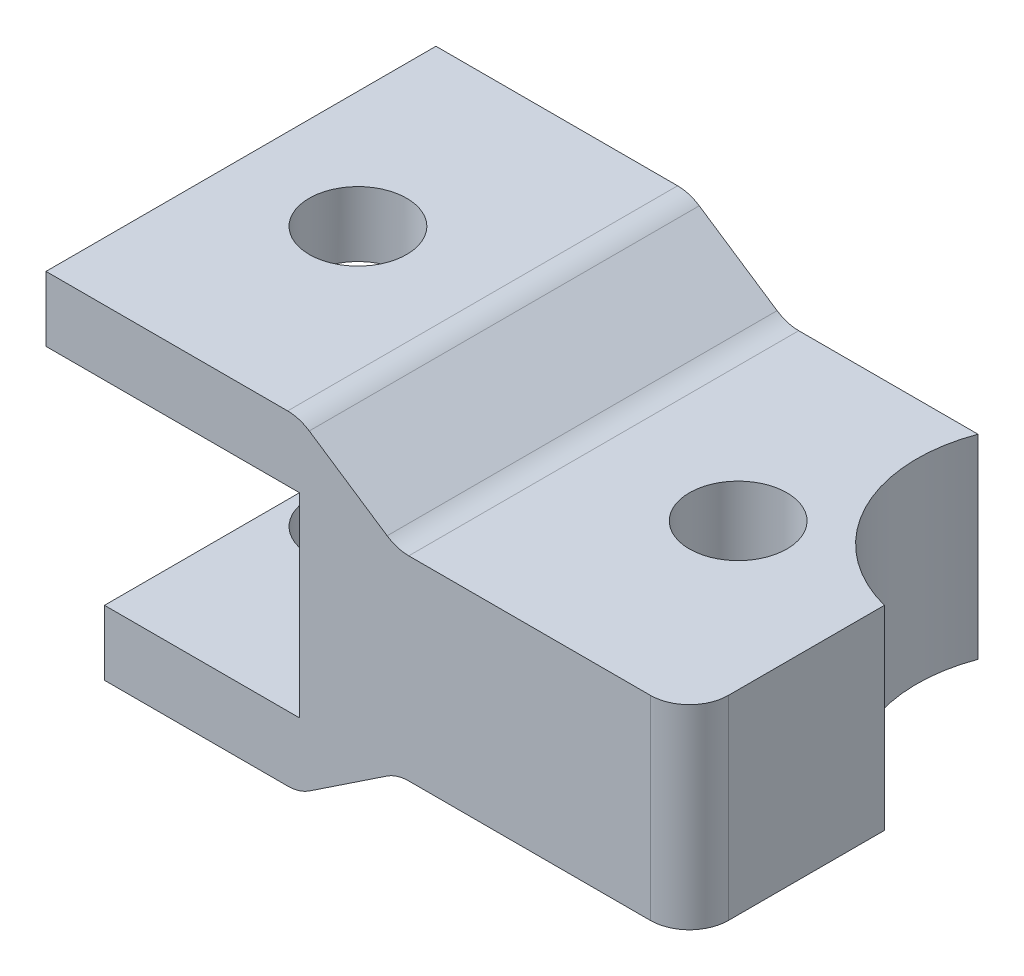
ISO-10303-21;
HEADER;
FILE_DESCRIPTION(('STEP AP214'),'2;1');
FILE_NAME('part.step','',(''),(''),'','','');
FILE_SCHEMA(('AUTOMOTIVE_DESIGN { 1 0 10303 214 1 1 1 1 }'));
ENDSEC;
DATA;
#1=APPLICATION_CONTEXT('core data for automotive mechanical design processes');
#2=APPLICATION_PROTOCOL_DEFINITION('international standard','automotive_design',2000,#1);
#3=PRODUCT_CONTEXT('',#1,'mechanical');
#4=PRODUCT('Part','Part','',(#3));
#5=PRODUCT_RELATED_PRODUCT_CATEGORY('part','',(#4));
#6=PRODUCT_DEFINITION_FORMATION('','',#4);
#7=PRODUCT_DEFINITION_CONTEXT('part definition',#1,'design');
#8=PRODUCT_DEFINITION('design','',#6,#7);
#9=PRODUCT_DEFINITION_SHAPE('','',#8);
#10=(LENGTH_UNIT() NAMED_UNIT(*) SI_UNIT(.MILLI.,.METRE.));
#11=(NAMED_UNIT(*) PLANE_ANGLE_UNIT() SI_UNIT($,.RADIAN.));
#12=(NAMED_UNIT(*) SI_UNIT($,.STERADIAN.) SOLID_ANGLE_UNIT());
#13=UNCERTAINTY_MEASURE_WITH_UNIT(LENGTH_MEASURE(1.E-05),#10,'distance_accuracy_value','');
#14=(GEOMETRIC_REPRESENTATION_CONTEXT(3) GLOBAL_UNCERTAINTY_ASSIGNED_CONTEXT((#13)) GLOBAL_UNIT_ASSIGNED_CONTEXT((#10,
#11,#12)) REPRESENTATION_CONTEXT('',''));
#15=CARTESIAN_POINT('',(0.,0.,0.));
#16=DIRECTION('',(0.,0.,1.));
#17=DIRECTION('',(1.,0.,0.));
#18=AXIS2_PLACEMENT_3D('',#15,#16,#17);
#19=CARTESIAN_POINT('',(5.85829192129549,-8.79095426364869,25.4));
#20=DIRECTION('',(-0.554546558579448,0.832152698948751,0.));
#21=DIRECTION('',(-0.832152698948751,-0.554546558579448,0.));
#22=AXIS2_PLACEMENT_3D('',#19,#20,#21);
#23=PLANE('',#22);
#24=DIRECTION('',(0.832152698948751,0.554546558579448,0.));
#25=VECTOR('',#24,1.);
#26=CARTESIAN_POINT('',(5.85829192129549,-8.79095426364869,0.));
#27=LINE('',#26,#25);
#28=CARTESIAN_POINT('',(13.3397541186527,-3.80530785532983,0.));
#29=VERTEX_POINT('',#28);
#30=CARTESIAN_POINT('',(18.4102458813473,-0.426332144670171,0.));
#31=VERTEX_POINT('',#30);
#32=EDGE_CURVE('E279',#29,#31,#27,.T.);
#33=ORIENTED_EDGE('',*,*,#32,.T.);
#34=DIRECTION('',(0.,0.,-1.));
#35=VECTOR('',#34,1.);
#36=CARTESIAN_POINT('',(18.4102458813473,-0.426332144670173,25.4));
#37=LINE('',#36,#35);
#38=CARTESIAN_POINT('',(18.4102458813473,-0.426332144670171,25.4));
#39=VERTEX_POINT('',#38);
#40=EDGE_CURVE('E356',#31,#39,#37,.F.);
#41=ORIENTED_EDGE('',*,*,#40,.T.);
#42=DIRECTION('',(0.832152698948751,0.554546558579448,0.));
#43=VECTOR('',#42,1.);
#44=CARTESIAN_POINT('',(5.85829192129549,-8.79095426364869,25.4));
#45=LINE('',#44,#43);
#46=CARTESIAN_POINT('',(13.3397541186527,-3.80530785532983,25.4));
#47=VERTEX_POINT('',#46);
#48=EDGE_CURVE('E255',#47,#39,#45,.T.);
#49=ORIENTED_EDGE('',*,*,#48,.F.);
#50=DIRECTION('',(0.,0.,-1.));
#51=VECTOR('',#50,1.);
#52=CARTESIAN_POINT('',(13.3397541186527,-3.80530785532983,25.4));
#53=LINE('',#52,#51);
#54=EDGE_CURVE('E353',#47,#29,#53,.T.);
#55=ORIENTED_EDGE('',*,*,#54,.T.);
#56=EDGE_LOOP('',(#33,#41,#49,#55));
#57=FACE_BOUND('',#56,.T.);
#58=ADVANCED_FACE('F86',(#57),#23,.F.);
#59=CARTESIAN_POINT('',(0.,0.,25.4));
#60=DIRECTION('',(0.,1.,0.));
#61=DIRECTION('',(0.,0.,1.));
#62=AXIS2_PLACEMENT_3D('',#59,#60,#61);
#63=PLANE('',#62);
#64=CARTESIAN_POINT('',(28.575,0.,12.7));
#65=DIRECTION('',(0.,1.,0.));
#66=DIRECTION('',(0.,0.,1.));
#67=AXIS2_PLACEMENT_3D('',#64,#65,#66);
#68=CIRCLE('',#67,3.175);
#69=CARTESIAN_POINT('',(28.575,0.,15.875));
#70=VERTEX_POINT('',#69);
#71=EDGE_CURVE('E235',#70,#70,#68,.T.);
#72=ORIENTED_EDGE('',*,*,#71,.T.);
#73=EDGE_LOOP('',(#72));
#74=FACE_BOUND('',#73,.T.);
#75=DIRECTION('',(0.,0.,-1.));
#76=VECTOR('',#75,1.);
#77=CARTESIAN_POINT('',(38.1,0.,25.4));
#78=LINE('',#77,#76);
#79=CARTESIAN_POINT('',(38.1,0.,22.86));
#80=VERTEX_POINT('',#79);
#81=CARTESIAN_POINT('',(38.1,0.,12.7));
#82=VERTEX_POINT('',#81);
#83=EDGE_CURVE('E208',#80,#82,#78,.T.);
#84=ORIENTED_EDGE('',*,*,#83,.F.);
#85=CARTESIAN_POINT('',(35.56,0.,22.86));
#86=DIRECTION('',(0.,1.,0.));
#87=DIRECTION('',(0.,0.,1.));
#88=AXIS2_PLACEMENT_3D('',#85,#86,#87);
#89=CIRCLE('',#88,2.54);
#90=CARTESIAN_POINT('',(35.56,0.,25.4));
#91=VERTEX_POINT('',#90);
#92=EDGE_CURVE('E351',#80,#91,#89,.F.);
#93=ORIENTED_EDGE('',*,*,#92,.T.);
#94=DIRECTION('',(1.,0.,0.));
#95=VECTOR('',#94,1.);
#96=CARTESIAN_POINT('',(0.,0.,25.4));
#97=LINE('',#96,#95);
#98=CARTESIAN_POINT('',(19.8187941401391,0.,25.4));
#99=VERTEX_POINT('',#98);
#100=EDGE_CURVE('E259',#99,#91,#97,.T.);
#101=ORIENTED_EDGE('',*,*,#100,.F.);
#102=DIRECTION('',(0.,0.,-1.));
#103=VECTOR('',#102,1.);
#104=CARTESIAN_POINT('',(19.8187941401391,0.,0.));
#105=LINE('',#104,#103);
#106=CARTESIAN_POINT('',(19.8187941401391,0.,0.));
#107=VERTEX_POINT('',#106);
#108=EDGE_CURVE('E349',#99,#107,#105,.T.);
#109=ORIENTED_EDGE('',*,*,#108,.T.);
#110=DIRECTION('',(1.,0.,0.));
#111=VECTOR('',#110,1.);
#112=CARTESIAN_POINT('',(0.,0.,0.));
#113=LINE('',#112,#111);
#114=CARTESIAN_POINT('',(31.497009702088,0.,0.));
#115=VERTEX_POINT('',#114);
#116=EDGE_CURVE('E231',#107,#115,#113,.T.);
#117=ORIENTED_EDGE('',*,*,#116,.T.);
#118=CARTESIAN_POINT('',(40.5242890458702,0.,3.37304744201766));
#119=DIRECTION('',(0.,1.,0.));
#120=DIRECTION('',(0.,0.,1.));
#121=AXIS2_PLACEMENT_3D('',#118,#119,#120);
#122=CIRCLE('',#121,9.63686782086273);
#123=EDGE_CURVE('E223',#115,#82,#122,.T.);
#124=ORIENTED_EDGE('',*,*,#123,.T.);
#125=EDGE_LOOP('',(#84,#93,#101,#109,#117,#124));
#126=FACE_BOUND('',#125,.T.);
#127=ADVANCED_FACE('F228',(#74,#126),#63,.F.);
#128=CARTESIAN_POINT('',(38.1,0.,25.4));
#129=DIRECTION('',(-1.,0.,0.));
#130=DIRECTION('',(0.,0.,1.));
#131=AXIS2_PLACEMENT_3D('',#128,#129,#130);
#132=PLANE('',#131);
#133=DIRECTION('',(0.,0.,-1.));
#134=VECTOR('',#133,1.);
#135=CARTESIAN_POINT('',(38.1,12.7,25.4));
#136=LINE('',#135,#134);
#137=CARTESIAN_POINT('',(38.1,12.7,22.86));
#138=VERTEX_POINT('',#137);
#139=CARTESIAN_POINT('',(38.1,12.7,12.7));
#140=VERTEX_POINT('',#139);
#141=EDGE_CURVE('E216',#138,#140,#136,.T.);
#142=ORIENTED_EDGE('',*,*,#141,.F.);
#143=DIRECTION('',(0.,1.,0.));
#144=VECTOR('',#143,1.);
#145=CARTESIAN_POINT('',(38.1,0.,22.86));
#146=LINE('',#145,#144);
#147=EDGE_CURVE('E101',#138,#80,#146,.F.);
#148=ORIENTED_EDGE('',*,*,#147,.T.);
#149=ORIENTED_EDGE('',*,*,#83,.T.);
#150=DIRECTION('',(0.,1.,0.));
#151=VECTOR('',#150,1.);
#152=CARTESIAN_POINT('',(38.1,-4.23164,12.7));
#153=LINE('',#152,#151);
#154=EDGE_CURVE('E211',#82,#140,#153,.T.);
#155=ORIENTED_EDGE('',*,*,#154,.T.);
#156=EDGE_LOOP('',(#142,#148,#149,#155));
#157=FACE_BOUND('',#156,.T.);
#158=ADVANCED_FACE('F210',(#157),#132,.F.);
#159=CARTESIAN_POINT('',(0.,12.7,25.4));
#160=DIRECTION('',(0.,1.,0.));
#161=DIRECTION('',(0.,0.,1.));
#162=AXIS2_PLACEMENT_3D('',#159,#160,#161);
#163=PLANE('',#162);
#164=DIRECTION('',(1.,0.,0.));
#165=VECTOR('',#164,1.);
#166=CARTESIAN_POINT('',(0.,12.7,0.));
#167=LINE('',#166,#165);
#168=CARTESIAN_POINT('',(19.8187941401391,12.7,0.));
#169=VERTEX_POINT('',#168);
#170=CARTESIAN_POINT('',(31.497009702088,12.7,0.));
#171=VERTEX_POINT('',#170);
#172=EDGE_CURVE('E284',#169,#171,#167,.T.);
#173=ORIENTED_EDGE('',*,*,#172,.F.);
#174=DIRECTION('',(0.,0.,-1.));
#175=VECTOR('',#174,1.);
#176=CARTESIAN_POINT('',(19.8187941401391,12.7,25.4));
#177=LINE('',#176,#175);
#178=CARTESIAN_POINT('',(19.8187941401391,12.7,25.4));
#179=VERTEX_POINT('',#178);
#180=EDGE_CURVE('E346',#169,#179,#177,.F.);
#181=ORIENTED_EDGE('',*,*,#180,.T.);
#182=DIRECTION('',(1.,0.,0.));
#183=VECTOR('',#182,1.);
#184=CARTESIAN_POINT('',(0.,12.7,25.4));
#185=LINE('',#184,#183);
#186=CARTESIAN_POINT('',(35.56,12.7,25.4));
#187=VERTEX_POINT('',#186);
#188=EDGE_CURVE('E262',#179,#187,#185,.T.);
#189=ORIENTED_EDGE('',*,*,#188,.T.);
#190=CARTESIAN_POINT('',(35.56,12.7,22.86));
#191=DIRECTION('',(0.,1.,0.));
#192=DIRECTION('',(0.,0.,1.));
#193=AXIS2_PLACEMENT_3D('',#190,#191,#192);
#194=CIRCLE('',#193,2.54);
#195=EDGE_CURVE('E109',#187,#138,#194,.T.);
#196=ORIENTED_EDGE('',*,*,#195,.T.);
#197=ORIENTED_EDGE('',*,*,#141,.T.);
#198=CARTESIAN_POINT('',(40.5242890458702,12.7,3.37304744201766));
#199=DIRECTION('',(0.,1.,0.));
#200=DIRECTION('',(0.,0.,1.));
#201=AXIS2_PLACEMENT_3D('',#198,#199,#200);
#202=CIRCLE('',#201,9.63686782086273);
#203=EDGE_CURVE('E226',#171,#140,#202,.T.);
#204=ORIENTED_EDGE('',*,*,#203,.F.);
#205=EDGE_LOOP('',(#173,#181,#189,#196,#197,#204));
#206=FACE_BOUND('',#205,.T.);
#207=CARTESIAN_POINT('',(28.575,12.7,12.7));
#208=DIRECTION('',(0.,1.,0.));
#209=DIRECTION('',(0.,0.,1.));
#210=AXIS2_PLACEMENT_3D('',#207,#208,#209);
#211=CIRCLE('',#210,3.175);
#212=CARTESIAN_POINT('',(28.575,12.7,15.875));
#213=VERTEX_POINT('',#212);
#214=EDGE_CURVE('E232',#213,#213,#211,.T.);
#215=ORIENTED_EDGE('',*,*,#214,.F.);
#216=EDGE_LOOP('',(#215));
#217=FACE_BOUND('',#216,.T.);
#218=ADVANCED_FACE('F385',(#206,#217),#163,.T.);
#219=CARTESIAN_POINT('',(11.7189280970613,17.5854263161184,25.4));
#220=DIRECTION('',(0.554546558579448,0.832152698948751,0.));
#221=DIRECTION('',(-0.832152698948751,0.554546558579448,0.));
#222=AXIS2_PLACEMENT_3D('',#219,#220,#221);
#223=PLANE('',#222);
#224=DIRECTION('',(0.832152698948751,-0.554546558579448,0.));
#225=VECTOR('',#224,1.);
#226=CARTESIAN_POINT('',(11.7189280970613,17.5854263161184,0.));
#227=LINE('',#226,#225);
#228=CARTESIAN_POINT('',(13.3397541186527,16.5053078553298,0.));
#229=VERTEX_POINT('',#228);
#230=CARTESIAN_POINT('',(18.4102458813473,13.1263321446702,0.));
#231=VERTEX_POINT('',#230);
#232=EDGE_CURVE('E286',#229,#231,#227,.T.);
#233=ORIENTED_EDGE('',*,*,#232,.F.);
#234=DIRECTION('',(0.,0.,-1.));
#235=VECTOR('',#234,1.);
#236=CARTESIAN_POINT('',(13.3397541186527,16.5053078553298,25.4));
#237=LINE('',#236,#235);
#238=CARTESIAN_POINT('',(13.3397541186527,16.5053078553298,25.4));
#239=VERTEX_POINT('',#238);
#240=EDGE_CURVE('E336',#229,#239,#237,.F.);
#241=ORIENTED_EDGE('',*,*,#240,.T.);
#242=DIRECTION('',(0.832152698948751,-0.554546558579448,0.));
#243=VECTOR('',#242,1.);
#244=CARTESIAN_POINT('',(11.7189280970613,17.5854263161184,25.4));
#245=LINE('',#244,#243);
#246=CARTESIAN_POINT('',(18.4102458813473,13.1263321446702,25.4));
#247=VERTEX_POINT('',#246);
#248=EDGE_CURVE('E264',#239,#247,#245,.T.);
#249=ORIENTED_EDGE('',*,*,#248,.T.);
#250=DIRECTION('',(0.,0.,-1.));
#251=VECTOR('',#250,1.);
#252=CARTESIAN_POINT('',(18.4102458813473,13.1263321446702,0.));
#253=LINE('',#252,#251);
#254=EDGE_CURVE('E333',#247,#231,#253,.T.);
#255=ORIENTED_EDGE('',*,*,#254,.T.);
#256=EDGE_LOOP('',(#233,#241,#249,#255));
#257=FACE_BOUND('',#256,.T.);
#258=ADVANCED_FACE('F394',(#257),#223,.T.);
#259=CARTESIAN_POINT('',(12.7,0.,25.4));
#260=DIRECTION('',(-1.,0.,0.));
#261=DIRECTION('',(0.,0.,1.));
#262=AXIS2_PLACEMENT_3D('',#259,#260,#261);
#263=PLANE('',#262);
#264=DIRECTION('',(0.,0.,1.));
#265=VECTOR('',#264,1.);
#266=CARTESIAN_POINT('',(12.7,12.7,25.4));
#267=LINE('',#266,#265);
#268=CARTESIAN_POINT('',(12.7,12.7,0.));
#269=VERTEX_POINT('',#268);
#270=CARTESIAN_POINT('',(12.7,12.7,25.4));
#271=VERTEX_POINT('',#270);
#272=EDGE_CURVE('E215',#269,#271,#267,.T.);
#273=ORIENTED_EDGE('',*,*,#272,.F.);
#274=DIRECTION('',(0.,1.,0.));
#275=VECTOR('',#274,1.);
#276=CARTESIAN_POINT('',(12.7,0.,0.));
#277=LINE('',#276,#275);
#278=CARTESIAN_POINT('',(12.7,0.,0.));
#279=VERTEX_POINT('',#278);
#280=EDGE_CURVE('E289',#279,#269,#277,.T.);
#281=ORIENTED_EDGE('',*,*,#280,.F.);
#282=DIRECTION('',(0.,0.,-1.));
#283=VECTOR('',#282,1.);
#284=CARTESIAN_POINT('',(12.7,0.,25.4));
#285=LINE('',#284,#283);
#286=CARTESIAN_POINT('',(12.7,0.,25.4));
#287=VERTEX_POINT('',#286);
#288=EDGE_CURVE('E300',#287,#279,#285,.T.);
#289=ORIENTED_EDGE('',*,*,#288,.F.);
#290=DIRECTION('',(0.,1.,0.));
#291=VECTOR('',#290,1.);
#292=CARTESIAN_POINT('',(12.7,0.,25.4));
#293=LINE('',#292,#291);
#294=EDGE_CURVE('E267',#287,#271,#293,.T.);
#295=ORIENTED_EDGE('',*,*,#294,.T.);
#296=EDGE_LOOP('',(#273,#281,#289,#295));
#297=FACE_BOUND('',#296,.T.);
#298=ADVANCED_FACE('F413',(#297),#263,.T.);
#299=CARTESIAN_POINT('',(0.,0.,25.4));
#300=DIRECTION('',(0.,1.,0.));
#301=DIRECTION('',(0.,0.,1.));
#302=AXIS2_PLACEMENT_3D('',#299,#300,#301);
#303=PLANE('',#302);
#304=CARTESIAN_POINT('',(3.8099999999996,0.,12.7000000000001));
#305=DIRECTION('',(0.,1.,0.));
#306=DIRECTION('',(0.,0.,1.));
#307=AXIS2_PLACEMENT_3D('',#304,#305,#306);
#308=CIRCLE('',#307,3.175);
#309=CARTESIAN_POINT('',(3.8099999999996,0.,15.8750000000001));
#310=VERTEX_POINT('',#309);
#311=EDGE_CURVE('E248',#310,#310,#308,.T.);
#312=ORIENTED_EDGE('',*,*,#311,.F.);
#313=EDGE_LOOP('',(#312));
#314=FACE_BOUND('',#313,.T.);
#315=DIRECTION('',(1.,0.,0.));
#316=VECTOR('',#315,1.);
#317=CARTESIAN_POINT('',(0.,0.,0.));
#318=LINE('',#317,#316);
#319=CARTESIAN_POINT('',(0.,0.,0.));
#320=VERTEX_POINT('',#319);
#321=EDGE_CURVE('E292',#320,#279,#318,.T.);
#322=ORIENTED_EDGE('',*,*,#321,.F.);
#323=DIRECTION('',(0.,0.,-1.));
#324=VECTOR('',#323,1.);
#325=CARTESIAN_POINT('',(0.,0.,25.4));
#326=LINE('',#325,#324);
#327=CARTESIAN_POINT('',(0.,0.,25.4));
#328=VERTEX_POINT('',#327);
#329=EDGE_CURVE('E298',#328,#320,#326,.T.);
#330=ORIENTED_EDGE('',*,*,#329,.F.);
#331=DIRECTION('',(1.,0.,0.));
#332=VECTOR('',#331,1.);
#333=CARTESIAN_POINT('',(0.,0.,25.4));
#334=LINE('',#333,#332);
#335=EDGE_CURVE('E270',#328,#287,#334,.T.);
#336=ORIENTED_EDGE('',*,*,#335,.T.);
#337=ORIENTED_EDGE('',*,*,#288,.T.);
#338=EDGE_LOOP('',(#322,#330,#336,#337));
#339=FACE_BOUND('',#338,.T.);
#340=ADVANCED_FACE('F418',(#314,#339),#303,.T.);
#341=CARTESIAN_POINT('',(0.,0.,25.4));
#342=DIRECTION('',(1.,0.,0.));
#343=DIRECTION('',(0.,0.,-1.));
#344=AXIS2_PLACEMENT_3D('',#341,#342,#343);
#345=PLANE('',#344);
#346=DIRECTION('',(0.,-1.,0.));
#347=VECTOR('',#346,1.);
#348=CARTESIAN_POINT('',(0.,0.,0.));
#349=LINE('',#348,#347);
#350=CARTESIAN_POINT('',(0.,-4.23164,0.));
#351=VERTEX_POINT('',#350);
#352=EDGE_CURVE('E256',#320,#351,#349,.T.);
#353=ORIENTED_EDGE('',*,*,#352,.T.);
#354=DIRECTION('',(0.,0.,-1.));
#355=VECTOR('',#354,1.);
#356=CARTESIAN_POINT('',(0.,-4.23164,25.4));
#357=LINE('',#356,#355);
#358=CARTESIAN_POINT('',(0.,-4.23164,25.4));
#359=VERTEX_POINT('',#358);
#360=EDGE_CURVE('E275',#359,#351,#357,.T.);
#361=ORIENTED_EDGE('',*,*,#360,.F.);
#362=DIRECTION('',(0.,-1.,0.));
#363=VECTOR('',#362,1.);
#364=CARTESIAN_POINT('',(0.,0.,25.4));
#365=LINE('',#364,#363);
#366=EDGE_CURVE('E273',#328,#359,#365,.T.);
#367=ORIENTED_EDGE('',*,*,#366,.F.);
#368=ORIENTED_EDGE('',*,*,#329,.T.);
#369=EDGE_LOOP('',(#353,#361,#367,#368));
#370=FACE_BOUND('',#369,.T.);
#371=ADVANCED_FACE('F424',(#370),#345,.F.);
#372=CARTESIAN_POINT('',(0.,-4.23164,25.4));
#373=DIRECTION('',(0.,1.,0.));
#374=DIRECTION('',(0.,0.,1.));
#375=AXIS2_PLACEMENT_3D('',#372,#373,#374);
#376=PLANE('',#375);
#377=CARTESIAN_POINT('',(3.8099999999996,-4.23164,12.7000000000001));
#378=DIRECTION('',(0.,1.,0.));
#379=DIRECTION('',(0.,0.,1.));
#380=AXIS2_PLACEMENT_3D('',#377,#378,#379);
#381=CIRCLE('',#380,3.175);
#382=CARTESIAN_POINT('',(3.8099999999996,-4.23164,15.8750000000001));
#383=VERTEX_POINT('',#382);
#384=EDGE_CURVE('E244',#383,#383,#381,.T.);
#385=ORIENTED_EDGE('',*,*,#384,.T.);
#386=EDGE_LOOP('',(#385));
#387=FACE_BOUND('',#386,.T.);
#388=DIRECTION('',(1.,0.,0.));
#389=VECTOR('',#388,1.);
#390=CARTESIAN_POINT('',(0.,-4.23164,0.));
#391=LINE('',#390,#389);
#392=CARTESIAN_POINT('',(11.9312058598609,-4.23164,0.));
#393=VERTEX_POINT('',#392);
#394=EDGE_CURVE('E276',#351,#393,#391,.T.);
#395=ORIENTED_EDGE('',*,*,#394,.T.);
#396=DIRECTION('',(0.,0.,-1.));
#397=VECTOR('',#396,1.);
#398=CARTESIAN_POINT('',(11.9312058598609,-4.23164,25.4));
#399=LINE('',#398,#397);
#400=CARTESIAN_POINT('',(11.9312058598609,-4.23164,25.4));
#401=VERTEX_POINT('',#400);
#402=EDGE_CURVE('E358',#393,#401,#399,.F.);
#403=ORIENTED_EDGE('',*,*,#402,.T.);
#404=DIRECTION('',(1.,0.,0.));
#405=VECTOR('',#404,1.);
#406=CARTESIAN_POINT('',(0.,-4.23164,25.4));
#407=LINE('',#406,#405);
#408=EDGE_CURVE('E252',#359,#401,#407,.T.);
#409=ORIENTED_EDGE('',*,*,#408,.F.);
#410=ORIENTED_EDGE('',*,*,#360,.T.);
#411=EDGE_LOOP('',(#395,#403,#409,#410));
#412=FACE_BOUND('',#411,.T.);
#413=ADVANCED_FACE('F428',(#387,#412),#376,.F.);
#414=CARTESIAN_POINT('',(0.,0.,0.));
#415=DIRECTION('',(0.,0.,1.));
#416=DIRECTION('',(1.,0.,0.));
#417=AXIS2_PLACEMENT_3D('',#414,#415,#416);
#418=PLANE('',#417);
#419=DIRECTION('',(-1.,0.,0.));
#420=VECTOR('',#419,1.);
#421=CARTESIAN_POINT('',(12.7,16.93164,0.));
#422=LINE('',#421,#420);
#423=CARTESIAN_POINT('',(11.9312058598609,16.93164,0.));
#424=VERTEX_POINT('',#423);
#425=CARTESIAN_POINT('',(-3.81000000000001,16.93164,0.));
#426=VERTEX_POINT('',#425);
#427=EDGE_CURVE('E309',#424,#426,#422,.T.);
#428=ORIENTED_EDGE('',*,*,#427,.F.);
#429=CARTESIAN_POINT('',(11.9312058598609,14.39164,0.));
#430=DIRECTION('',(0.,0.,1.));
#431=DIRECTION('',(1.,0.,0.));
#432=AXIS2_PLACEMENT_3D('',#429,#430,#431);
#433=CIRCLE('',#432,2.54);
#434=EDGE_CURVE('E331',#424,#229,#433,.F.);
#435=ORIENTED_EDGE('',*,*,#434,.T.);
#436=ORIENTED_EDGE('',*,*,#232,.T.);
#437=CARTESIAN_POINT('',(19.8187941401391,15.24,0.));
#438=DIRECTION('',(0.,0.,1.));
#439=DIRECTION('',(1.,0.,0.));
#440=AXIS2_PLACEMENT_3D('',#437,#438,#439);
#441=CIRCLE('',#440,2.54);
#442=EDGE_CURVE('E360',#231,#169,#441,.T.);
#443=ORIENTED_EDGE('',*,*,#442,.T.);
#444=ORIENTED_EDGE('',*,*,#172,.T.);
#445=DIRECTION('',(0.,1.,0.));
#446=VECTOR('',#445,1.);
#447=CARTESIAN_POINT('',(31.497009702088,-4.23164,0.));
#448=LINE('',#447,#446);
#449=EDGE_CURVE('E304',#171,#115,#448,.F.);
#450=ORIENTED_EDGE('',*,*,#449,.T.);
#451=ORIENTED_EDGE('',*,*,#116,.F.);
#452=CARTESIAN_POINT('',(19.8187941401391,-2.54,0.));
#453=DIRECTION('',(0.,0.,1.));
#454=DIRECTION('',(1.,0.,0.));
#455=AXIS2_PLACEMENT_3D('',#452,#453,#454);
#456=CIRCLE('',#455,2.54);
#457=EDGE_CURVE('E94',#107,#31,#456,.T.);
#458=ORIENTED_EDGE('',*,*,#457,.T.);
#459=ORIENTED_EDGE('',*,*,#32,.F.);
#460=CARTESIAN_POINT('',(11.9312058598609,-1.69164,0.));
#461=DIRECTION('',(0.,0.,1.));
#462=DIRECTION('',(1.,0.,0.));
#463=AXIS2_PLACEMENT_3D('',#460,#461,#462);
#464=CIRCLE('',#463,2.54);
#465=EDGE_CURVE('E329',#29,#393,#464,.F.);
#466=ORIENTED_EDGE('',*,*,#465,.T.);
#467=ORIENTED_EDGE('',*,*,#394,.F.);
#468=ORIENTED_EDGE('',*,*,#352,.F.);
#469=ORIENTED_EDGE('',*,*,#321,.T.);
#470=ORIENTED_EDGE('',*,*,#280,.T.);
#471=DIRECTION('',(-1.,0.,0.));
#472=VECTOR('',#471,1.);
#473=CARTESIAN_POINT('',(12.7,12.7,0.));
#474=LINE('',#473,#472);
#475=CARTESIAN_POINT('',(-3.81000000000001,12.7,0.));
#476=VERTEX_POINT('',#475);
#477=EDGE_CURVE('E251',#269,#476,#474,.T.);
#478=ORIENTED_EDGE('',*,*,#477,.T.);
#479=DIRECTION('',(0.,-1.,0.));
#480=VECTOR('',#479,1.);
#481=CARTESIAN_POINT('',(-3.81000000000001,16.93164,0.));
#482=LINE('',#481,#480);
#483=EDGE_CURVE('E316',#426,#476,#482,.T.);
#484=ORIENTED_EDGE('',*,*,#483,.F.);
#485=EDGE_LOOP('',(#428,#435,#436,#443,#444,#450,#451,#458,#459,#466,#467,#468,#469,#470,#478,#484));
#486=FACE_BOUND('',#485,.T.);
#487=ADVANCED_FACE('F366',(#486),#418,.F.);
#488=CARTESIAN_POINT('',(0.,0.,25.4));
#489=DIRECTION('',(0.,0.,1.));
#490=DIRECTION('',(1.,0.,0.));
#491=AXIS2_PLACEMENT_3D('',#488,#489,#490);
#492=PLANE('',#491);
#493=ORIENTED_EDGE('',*,*,#248,.F.);
#494=CARTESIAN_POINT('',(11.9312058598609,14.39164,25.4));
#495=DIRECTION('',(0.,0.,1.));
#496=DIRECTION('',(1.,0.,0.));
#497=AXIS2_PLACEMENT_3D('',#494,#495,#496);
#498=CIRCLE('',#497,2.54);
#499=CARTESIAN_POINT('',(11.9312058598609,16.93164,25.4));
#500=VERTEX_POINT('',#499);
#501=EDGE_CURVE('E343',#239,#500,#498,.T.);
#502=ORIENTED_EDGE('',*,*,#501,.T.);
#503=DIRECTION('',(-1.,0.,0.));
#504=VECTOR('',#503,1.);
#505=CARTESIAN_POINT('',(12.7,16.93164,25.4));
#506=LINE('',#505,#504);
#507=CARTESIAN_POINT('',(-3.81000000000001,16.93164,25.4));
#508=VERTEX_POINT('',#507);
#509=EDGE_CURVE('E311',#500,#508,#506,.T.);
#510=ORIENTED_EDGE('',*,*,#509,.T.);
#511=DIRECTION('',(0.,-1.,0.));
#512=VECTOR('',#511,1.);
#513=CARTESIAN_POINT('',(-3.81000000000001,16.93164,25.4));
#514=LINE('',#513,#512);
#515=CARTESIAN_POINT('',(-3.81000000000001,12.7,25.4));
#516=VERTEX_POINT('',#515);
#517=EDGE_CURVE('E308',#508,#516,#514,.T.);
#518=ORIENTED_EDGE('',*,*,#517,.T.);
#519=DIRECTION('',(-1.,0.,0.));
#520=VECTOR('',#519,1.);
#521=CARTESIAN_POINT('',(12.7,12.7,25.4));
#522=LINE('',#521,#520);
#523=EDGE_CURVE('E305',#271,#516,#522,.T.);
#524=ORIENTED_EDGE('',*,*,#523,.F.);
#525=ORIENTED_EDGE('',*,*,#294,.F.);
#526=ORIENTED_EDGE('',*,*,#335,.F.);
#527=ORIENTED_EDGE('',*,*,#366,.T.);
#528=ORIENTED_EDGE('',*,*,#408,.T.);
#529=CARTESIAN_POINT('',(11.9312058598609,-1.69164,25.4));
#530=DIRECTION('',(0.,0.,1.));
#531=DIRECTION('',(1.,0.,0.));
#532=AXIS2_PLACEMENT_3D('',#529,#530,#531);
#533=CIRCLE('',#532,2.54);
#534=EDGE_CURVE('E338',#401,#47,#533,.T.);
#535=ORIENTED_EDGE('',*,*,#534,.T.);
#536=ORIENTED_EDGE('',*,*,#48,.T.);
#537=CARTESIAN_POINT('',(19.8187941401391,-2.54,25.4));
#538=DIRECTION('',(0.,0.,1.));
#539=DIRECTION('',(1.,0.,0.));
#540=AXIS2_PLACEMENT_3D('',#537,#538,#539);
#541=CIRCLE('',#540,2.54);
#542=EDGE_CURVE('E12',#39,#99,#541,.F.);
#543=ORIENTED_EDGE('',*,*,#542,.T.);
#544=ORIENTED_EDGE('',*,*,#100,.T.);
#545=DIRECTION('',(0.,1.,0.));
#546=VECTOR('',#545,1.);
#547=CARTESIAN_POINT('',(35.56,12.7,25.4));
#548=LINE('',#547,#546);
#549=EDGE_CURVE('E340',#91,#187,#548,.T.);
#550=ORIENTED_EDGE('',*,*,#549,.T.);
#551=ORIENTED_EDGE('',*,*,#188,.F.);
#552=CARTESIAN_POINT('',(19.8187941401391,15.24,25.4));
#553=DIRECTION('',(0.,0.,1.));
#554=DIRECTION('',(1.,0.,0.));
#555=AXIS2_PLACEMENT_3D('',#552,#553,#554);
#556=CIRCLE('',#555,2.54);
#557=EDGE_CURVE('E362',#179,#247,#556,.F.);
#558=ORIENTED_EDGE('',*,*,#557,.T.);
#559=EDGE_LOOP('',(#493,#502,#510,#518,#524,#525,#526,#527,#528,#535,#536,#543,#544,#550,#551,#558));
#560=FACE_BOUND('',#559,.T.);
#561=ADVANCED_FACE('F378',(#560),#492,.T.);
#562=CARTESIAN_POINT('',(12.7,16.93164,25.4));
#563=DIRECTION('',(0.,-1.,0.));
#564=DIRECTION('',(0.,0.,-1.));
#565=AXIS2_PLACEMENT_3D('',#562,#563,#564);
#566=PLANE('',#565);
#567=CARTESIAN_POINT('',(3.8099999999996,16.93164,12.7000000000001));
#568=DIRECTION('',(0.,1.,0.));
#569=DIRECTION('',(0.,0.,1.));
#570=AXIS2_PLACEMENT_3D('',#567,#568,#569);
#571=CIRCLE('',#570,3.175);
#572=CARTESIAN_POINT('',(3.8099999999996,16.93164,15.8750000000001));
#573=VERTEX_POINT('',#572);
#574=EDGE_CURVE('E241',#573,#573,#571,.T.);
#575=ORIENTED_EDGE('',*,*,#574,.F.);
#576=EDGE_LOOP('',(#575));
#577=FACE_BOUND('',#576,.T.);
#578=ORIENTED_EDGE('',*,*,#509,.F.);
#579=DIRECTION('',(0.,0.,-1.));
#580=VECTOR('',#579,1.);
#581=CARTESIAN_POINT('',(11.9312058598609,16.93164,0.));
#582=LINE('',#581,#580);
#583=EDGE_CURVE('E326',#500,#424,#582,.T.);
#584=ORIENTED_EDGE('',*,*,#583,.T.);
#585=ORIENTED_EDGE('',*,*,#427,.T.);
#586=DIRECTION('',(0.,0.,-1.));
#587=VECTOR('',#586,1.);
#588=CARTESIAN_POINT('',(-3.81000000000001,16.93164,25.4));
#589=LINE('',#588,#587);
#590=EDGE_CURVE('E280',#508,#426,#589,.T.);
#591=ORIENTED_EDGE('',*,*,#590,.F.);
#592=EDGE_LOOP('',(#578,#584,#585,#591));
#593=FACE_BOUND('',#592,.T.);
#594=ADVANCED_FACE('F402',(#577,#593),#566,.F.);
#595=CARTESIAN_POINT('',(-3.81000000000001,16.93164,25.4));
#596=DIRECTION('',(1.,0.,0.));
#597=DIRECTION('',(0.,1.,0.));
#598=AXIS2_PLACEMENT_3D('',#595,#596,#597);
#599=PLANE('',#598);
#600=ORIENTED_EDGE('',*,*,#483,.T.);
#601=DIRECTION('',(0.,0.,-1.));
#602=VECTOR('',#601,1.);
#603=CARTESIAN_POINT('',(-3.81000000000001,12.7,25.4));
#604=LINE('',#603,#602);
#605=EDGE_CURVE('E313',#516,#476,#604,.T.);
#606=ORIENTED_EDGE('',*,*,#605,.F.);
#607=ORIENTED_EDGE('',*,*,#517,.F.);
#608=ORIENTED_EDGE('',*,*,#590,.T.);
#609=EDGE_LOOP('',(#600,#606,#607,#608));
#610=FACE_BOUND('',#609,.T.);
#611=ADVANCED_FACE('F407',(#610),#599,.F.);
#612=CARTESIAN_POINT('',(12.7,12.7,25.4));
#613=DIRECTION('',(0.,-1.,0.));
#614=DIRECTION('',(0.,0.,-1.));
#615=AXIS2_PLACEMENT_3D('',#612,#613,#614);
#616=PLANE('',#615);
#617=CARTESIAN_POINT('',(3.8099999999996,12.7,12.7000000000001));
#618=DIRECTION('',(0.,-1.,0.));
#619=DIRECTION('',(0.,0.,-1.));
#620=AXIS2_PLACEMENT_3D('',#617,#618,#619);
#621=CIRCLE('',#620,3.175);
#622=CARTESIAN_POINT('',(3.8099999999996,12.7,9.52500000000006));
#623=VERTEX_POINT('',#622);
#624=EDGE_CURVE('E247',#623,#623,#621,.T.);
#625=ORIENTED_EDGE('',*,*,#624,.F.);
#626=EDGE_LOOP('',(#625));
#627=FACE_BOUND('',#626,.T.);
#628=ORIENTED_EDGE('',*,*,#477,.F.);
#629=ORIENTED_EDGE('',*,*,#272,.T.);
#630=ORIENTED_EDGE('',*,*,#523,.T.);
#631=ORIENTED_EDGE('',*,*,#605,.T.);
#632=EDGE_LOOP('',(#628,#629,#630,#631));
#633=FACE_BOUND('',#632,.T.);
#634=ADVANCED_FACE('F431',(#627,#633),#616,.T.);
#635=CARTESIAN_POINT('',(3.8099999999996,-4.23164,12.7000000000001));
#636=DIRECTION('',(0.,1.,0.));
#637=DIRECTION('',(0.,0.,1.));
#638=AXIS2_PLACEMENT_3D('',#635,#636,#637);
#639=CYLINDRICAL_SURFACE('',#638,3.175);
#640=ORIENTED_EDGE('',*,*,#624,.T.);
#641=EDGE_LOOP('',(#640));
#642=FACE_BOUND('',#641,.T.);
#643=ORIENTED_EDGE('',*,*,#574,.T.);
#644=EDGE_LOOP('',(#643));
#645=FACE_BOUND('',#644,.T.);
#646=ADVANCED_FACE('F433',(#642,#645),#639,.F.);
#647=ORIENTED_EDGE('',*,*,#311,.T.);
#648=EDGE_LOOP('',(#647));
#649=FACE_BOUND('',#648,.T.);
#650=ORIENTED_EDGE('',*,*,#384,.F.);
#651=EDGE_LOOP('',(#650));
#652=FACE_BOUND('',#651,.T.);
#653=ADVANCED_FACE('F440',(#649,#652),#639,.F.);
#654=CARTESIAN_POINT('',(28.575,-4.23164,12.7));
#655=DIRECTION('',(0.,1.,0.));
#656=DIRECTION('',(0.,0.,1.));
#657=AXIS2_PLACEMENT_3D('',#654,#655,#656);
#658=CYLINDRICAL_SURFACE('',#657,3.175);
#659=ORIENTED_EDGE('',*,*,#214,.T.);
#660=EDGE_LOOP('',(#659));
#661=FACE_BOUND('',#660,.T.);
#662=ORIENTED_EDGE('',*,*,#71,.F.);
#663=EDGE_LOOP('',(#662));
#664=FACE_BOUND('',#663,.T.);
#665=ADVANCED_FACE('F550',(#661,#664),#658,.F.);
#666=CARTESIAN_POINT('',(40.5242890458702,-4.23164,3.37304744201766));
#667=DIRECTION('',(0.,1.,0.));
#668=DIRECTION('',(0.,0.,1.));
#669=AXIS2_PLACEMENT_3D('',#666,#667,#668);
#670=CYLINDRICAL_SURFACE('',#669,9.63686782086273);
#671=ORIENTED_EDGE('',*,*,#449,.F.);
#672=ORIENTED_EDGE('',*,*,#203,.T.);
#673=ORIENTED_EDGE('',*,*,#154,.F.);
#674=ORIENTED_EDGE('',*,*,#123,.F.);
#675=EDGE_LOOP('',(#671,#672,#673,#674));
#676=FACE_BOUND('',#675,.T.);
#677=ADVANCED_FACE('F222',(#676),#670,.F.);
#678=CARTESIAN_POINT('',(11.9312058598609,14.39164,25.4));
#679=DIRECTION('',(0.,0.,1.));
#680=DIRECTION('',(1.,0.,0.));
#681=AXIS2_PLACEMENT_3D('',#678,#679,#680);
#682=CYLINDRICAL_SURFACE('',#681,2.54);
#683=ORIENTED_EDGE('',*,*,#501,.F.);
#684=ORIENTED_EDGE('',*,*,#240,.F.);
#685=ORIENTED_EDGE('',*,*,#434,.F.);
#686=ORIENTED_EDGE('',*,*,#583,.F.);
#687=EDGE_LOOP('',(#683,#684,#685,#686));
#688=FACE_BOUND('',#687,.T.);
#689=ADVANCED_FACE('F397',(#688),#682,.T.);
#690=CARTESIAN_POINT('',(19.8187941401391,15.24,25.4));
#691=DIRECTION('',(0.,0.,1.));
#692=DIRECTION('',(1.,0.,0.));
#693=AXIS2_PLACEMENT_3D('',#690,#691,#692);
#694=CYLINDRICAL_SURFACE('',#693,2.54);
#695=ORIENTED_EDGE('',*,*,#557,.F.);
#696=ORIENTED_EDGE('',*,*,#180,.F.);
#697=ORIENTED_EDGE('',*,*,#442,.F.);
#698=ORIENTED_EDGE('',*,*,#254,.F.);
#699=EDGE_LOOP('',(#695,#696,#697,#698));
#700=FACE_BOUND('',#699,.T.);
#701=ADVANCED_FACE('F389',(#700),#694,.F.);
#702=CARTESIAN_POINT('',(35.56,0.,22.86));
#703=DIRECTION('',(0.,-1.,0.));
#704=DIRECTION('',(0.,0.,-1.));
#705=AXIS2_PLACEMENT_3D('',#702,#703,#704);
#706=CYLINDRICAL_SURFACE('',#705,2.54);
#707=ORIENTED_EDGE('',*,*,#92,.F.);
#708=ORIENTED_EDGE('',*,*,#147,.F.);
#709=ORIENTED_EDGE('',*,*,#195,.F.);
#710=ORIENTED_EDGE('',*,*,#549,.F.);
#711=EDGE_LOOP('',(#707,#708,#709,#710));
#712=FACE_BOUND('',#711,.T.);
#713=ADVANCED_FACE('F381',(#712),#706,.T.);
#714=CARTESIAN_POINT('',(19.8187941401391,-2.54,25.4));
#715=DIRECTION('',(0.,0.,1.));
#716=DIRECTION('',(1.,0.,0.));
#717=AXIS2_PLACEMENT_3D('',#714,#715,#716);
#718=CYLINDRICAL_SURFACE('',#717,2.54);
#719=ORIENTED_EDGE('',*,*,#542,.F.);
#720=ORIENTED_EDGE('',*,*,#40,.F.);
#721=ORIENTED_EDGE('',*,*,#457,.F.);
#722=ORIENTED_EDGE('',*,*,#108,.F.);
#723=EDGE_LOOP('',(#719,#720,#721,#722));
#724=FACE_BOUND('',#723,.T.);
#725=ADVANCED_FACE('F374',(#724),#718,.F.);
#726=CARTESIAN_POINT('',(11.9312058598609,-1.69164,25.4));
#727=DIRECTION('',(0.,0.,-1.));
#728=DIRECTION('',(-1.,0.,0.));
#729=AXIS2_PLACEMENT_3D('',#726,#727,#728);
#730=CYLINDRICAL_SURFACE('',#729,2.54);
#731=ORIENTED_EDGE('',*,*,#534,.F.);
#732=ORIENTED_EDGE('',*,*,#402,.F.);
#733=ORIENTED_EDGE('',*,*,#465,.F.);
#734=ORIENTED_EDGE('',*,*,#54,.F.);
#735=EDGE_LOOP('',(#731,#732,#733,#734));
#736=FACE_BOUND('',#735,.T.);
#737=ADVANCED_FACE('F88',(#736),#730,.T.);
#738=CLOSED_SHELL('',(#58,#127,#158,#218,#258,#298,#340,#371,#413,#487,#561,#594,#611,#634,#646,
#653,#665,#677,#689,#701,#713,#725,#737));
#739=MANIFOLD_SOLID_BREP('B2',#738);
#740=ADVANCED_BREP_SHAPE_REPRESENTATION('',(#18,#739),#14);
#741=SHAPE_DEFINITION_REPRESENTATION(#9,#740);
ENDSEC;
END-ISO-10303-21;
